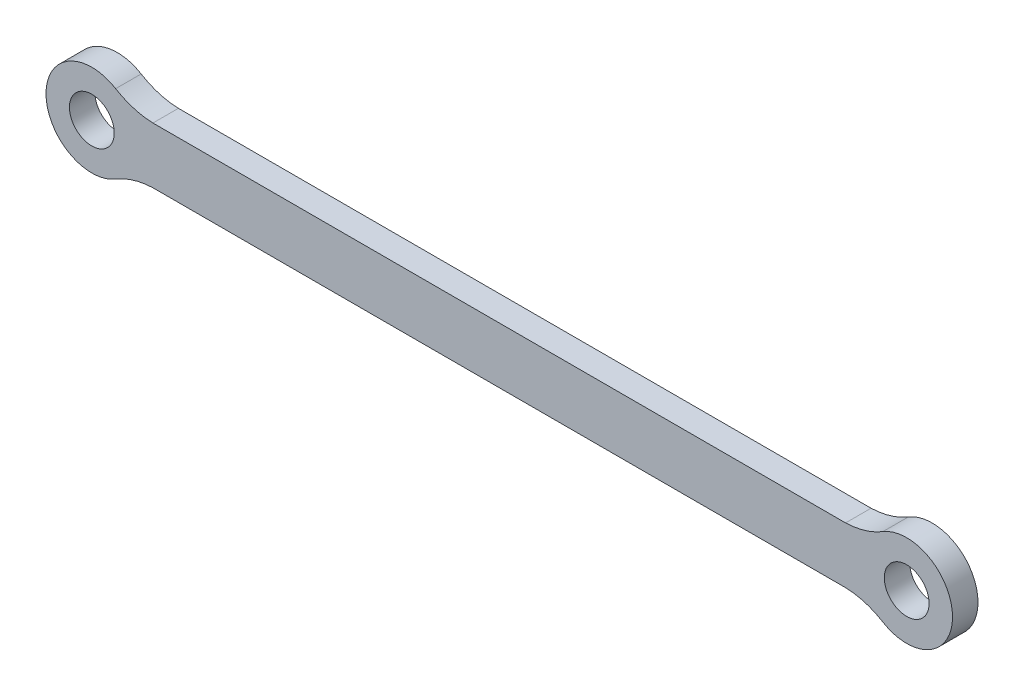
ISO-10303-21;
HEADER;
FILE_DESCRIPTION(('STEP AP214'),'2;1');
FILE_NAME('part.step','',(''),(''),'','','');
FILE_SCHEMA(('AUTOMOTIVE_DESIGN { 1 0 10303 214 1 1 1 1 }'));
ENDSEC;
DATA;
#1=APPLICATION_CONTEXT('core data for automotive mechanical design processes');
#2=APPLICATION_PROTOCOL_DEFINITION('international standard','automotive_design',2000,#1);
#3=PRODUCT_CONTEXT('',#1,'mechanical');
#4=PRODUCT('Part','Part','',(#3));
#5=PRODUCT_RELATED_PRODUCT_CATEGORY('part','',(#4));
#6=PRODUCT_DEFINITION_FORMATION('','',#4);
#7=PRODUCT_DEFINITION_CONTEXT('part definition',#1,'design');
#8=PRODUCT_DEFINITION('design','',#6,#7);
#9=PRODUCT_DEFINITION_SHAPE('','',#8);
#10=(LENGTH_UNIT() NAMED_UNIT(*) SI_UNIT(.MILLI.,.METRE.));
#11=(NAMED_UNIT(*) PLANE_ANGLE_UNIT() SI_UNIT($,.RADIAN.));
#12=(NAMED_UNIT(*) SI_UNIT($,.STERADIAN.) SOLID_ANGLE_UNIT());
#13=UNCERTAINTY_MEASURE_WITH_UNIT(LENGTH_MEASURE(1.E-05),#10,'distance_accuracy_value','');
#14=(GEOMETRIC_REPRESENTATION_CONTEXT(3) GLOBAL_UNCERTAINTY_ASSIGNED_CONTEXT((#13)) GLOBAL_UNIT_ASSIGNED_CONTEXT((#10,
#11,#12)) REPRESENTATION_CONTEXT('',''));
#15=CARTESIAN_POINT('',(0.,0.,0.));
#16=DIRECTION('',(0.,0.,1.));
#17=DIRECTION('',(1.,0.,0.));
#18=AXIS2_PLACEMENT_3D('',#15,#16,#17);
#19=CARTESIAN_POINT('',(-67.5199342692378,-20.499950228253,5.));
#20=DIRECTION('',(0.,0.,1.));
#21=DIRECTION('',(1.,0.,0.));
#22=AXIS2_PLACEMENT_3D('',#19,#20,#21);
#23=PLANE('',#22);
#24=CARTESIAN_POINT('',(-80.,0.,5.));
#25=DIRECTION('',(0.,0.,1.));
#26=DIRECTION('',(1.,0.,0.));
#27=AXIS2_PLACEMENT_3D('',#24,#25,#26);
#28=CIRCLE('',#27,4.40000000000001);
#29=CARTESIAN_POINT('',(-75.6,0.,5.));
#30=VERTEX_POINT('',#29);
#31=EDGE_CURVE('E133',#30,#30,#28,.T.);
#32=ORIENTED_EDGE('',*,*,#31,.F.);
#33=EDGE_LOOP('',(#32));
#34=FACE_BOUND('',#33,.T.);
#35=CARTESIAN_POINT('',(-67.5199342692378,-20.499950228253,5.));
#36=DIRECTION('',(0.,0.,-1.));
#37=DIRECTION('',(1.,0.,0.));
#38=AXIS2_PLACEMENT_3D('',#35,#36,#37);
#39=CIRCLE('',#38,14.9999999999772);
#40=CARTESIAN_POINT('',(-75.320005990589,-7.68749998869718,5.));
#41=VERTEX_POINT('',#40);
#42=CARTESIAN_POINT('',(-68.,-5.50763429996943,5.));
#43=VERTEX_POINT('',#42);
#44=EDGE_CURVE('E144',#41,#43,#39,.T.);
#45=ORIENTED_EDGE('',*,*,#44,.T.);
#46=DIRECTION('',(1.,0.,0.));
#47=VECTOR('',#46,1.);
#48=CARTESIAN_POINT('',(-68.,-5.50763429996943,5.));
#49=LINE('',#48,#47);
#50=CARTESIAN_POINT('',(68.,-5.50763429996943,5.));
#51=VERTEX_POINT('',#50);
#52=EDGE_CURVE('E92',#43,#51,#49,.T.);
#53=ORIENTED_EDGE('',*,*,#52,.T.);
#54=CARTESIAN_POINT('',(67.519934269238,-20.499950228253,5.));
#55=DIRECTION('',(0.,0.,-1.));
#56=DIRECTION('',(1.,0.,0.));
#57=AXIS2_PLACEMENT_3D('',#54,#55,#56);
#58=CIRCLE('',#57,14.9999999999772);
#59=CARTESIAN_POINT('',(75.3200060094935,-7.68750000020588,5.));
#60=VERTEX_POINT('',#59);
#61=EDGE_CURVE('E159',#51,#60,#58,.T.);
#62=ORIENTED_EDGE('',*,*,#61,.T.);
#63=CARTESIAN_POINT('',(80.,0.,5.));
#64=DIRECTION('',(0.,0.,1.));
#65=DIRECTION('',(1.,0.,0.));
#66=AXIS2_PLACEMENT_3D('',#63,#64,#65);
#67=CIRCLE('',#66,9.00000000024122);
#68=CARTESIAN_POINT('',(75.3200060094935,7.68750000020587,5.));
#69=VERTEX_POINT('',#68);
#70=EDGE_CURVE('E172',#60,#69,#67,.T.);
#71=ORIENTED_EDGE('',*,*,#70,.T.);
#72=CARTESIAN_POINT('',(67.5199342999245,20.4999502469346,5.));
#73=DIRECTION('',(0.,0.,-1.));
#74=DIRECTION('',(1.,0.,0.));
#75=AXIS2_PLACEMENT_3D('',#72,#73,#74);
#76=CIRCLE('',#75,14.9999999999772);
#77=CARTESIAN_POINT('',(68.,5.50763431766841,5.));
#78=VERTEX_POINT('',#77);
#79=EDGE_CURVE('E111',#69,#78,#76,.T.);
#80=ORIENTED_EDGE('',*,*,#79,.T.);
#81=DIRECTION('',(-1.,0.,0.));
#82=VECTOR('',#81,1.);
#83=CARTESIAN_POINT('',(68.,5.50763431766841,5.));
#84=LINE('',#83,#82);
#85=CARTESIAN_POINT('',(-68.,5.5076343176684,5.));
#86=VERTEX_POINT('',#85);
#87=EDGE_CURVE('E105',#78,#86,#84,.T.);
#88=ORIENTED_EDGE('',*,*,#87,.T.);
#89=CARTESIAN_POINT('',(-67.5199342999242,20.4999502469346,5.));
#90=DIRECTION('',(0.,0.,-1.));
#91=DIRECTION('',(1.,0.,0.));
#92=AXIS2_PLACEMENT_3D('',#89,#90,#91);
#93=CIRCLE('',#92,14.9999999999772);
#94=CARTESIAN_POINT('',(-75.320005990589,7.68749998869718,5.));
#95=VERTEX_POINT('',#94);
#96=EDGE_CURVE('E109',#86,#95,#93,.T.);
#97=ORIENTED_EDGE('',*,*,#96,.T.);
#98=CARTESIAN_POINT('',(-80.,0.,5.));
#99=DIRECTION('',(0.,0.,1.));
#100=DIRECTION('',(1.,0.,0.));
#101=AXIS2_PLACEMENT_3D('',#98,#99,#100);
#102=CIRCLE('',#101,9.00000000024122);
#103=EDGE_CURVE('E49',#95,#41,#102,.T.);
#104=ORIENTED_EDGE('',*,*,#103,.T.);
#105=EDGE_LOOP('',(#45,#53,#62,#71,#80,#88,#97,#104));
#106=FACE_BOUND('',#105,.T.);
#107=CARTESIAN_POINT('',(80.,0.,5.));
#108=DIRECTION('',(0.,0.,1.));
#109=DIRECTION('',(1.,0.,0.));
#110=AXIS2_PLACEMENT_3D('',#107,#108,#109);
#111=CIRCLE('',#110,4.39999999999995);
#112=CARTESIAN_POINT('',(84.4,0.,5.));
#113=VERTEX_POINT('',#112);
#114=EDGE_CURVE('E181',#113,#113,#111,.T.);
#115=ORIENTED_EDGE('',*,*,#114,.F.);
#116=EDGE_LOOP('',(#115));
#117=FACE_BOUND('',#116,.T.);
#118=ADVANCED_FACE('F32',(#34,#106,#117),#23,.T.);
#119=CARTESIAN_POINT('',(-67.5199342692378,-20.499950228253,0.));
#120=DIRECTION('',(0.,0.,1.));
#121=DIRECTION('',(1.,0.,0.));
#122=AXIS2_PLACEMENT_3D('',#119,#120,#121);
#123=PLANE('',#122);
#124=CARTESIAN_POINT('',(-67.5199342692378,-20.499950228253,0.));
#125=DIRECTION('',(0.,0.,-1.));
#126=DIRECTION('',(1.,0.,0.));
#127=AXIS2_PLACEMENT_3D('',#124,#125,#126);
#128=CIRCLE('',#127,14.9999999999772);
#129=CARTESIAN_POINT('',(-75.320005990589,-7.68749998869718,0.));
#130=VERTEX_POINT('',#129);
#131=CARTESIAN_POINT('',(-68.,-5.50763429996943,0.));
#132=VERTEX_POINT('',#131);
#133=EDGE_CURVE('E129',#130,#132,#128,.T.);
#134=ORIENTED_EDGE('',*,*,#133,.F.);
#135=CARTESIAN_POINT('',(-80.,0.,0.));
#136=DIRECTION('',(0.,0.,1.));
#137=DIRECTION('',(1.,0.,0.));
#138=AXIS2_PLACEMENT_3D('',#135,#136,#137);
#139=CIRCLE('',#138,9.00000000024122);
#140=CARTESIAN_POINT('',(-75.320005990589,7.68749998869718,0.));
#141=VERTEX_POINT('',#140);
#142=EDGE_CURVE('E84',#141,#130,#139,.T.);
#143=ORIENTED_EDGE('',*,*,#142,.F.);
#144=CARTESIAN_POINT('',(-67.5199342999242,20.4999502469346,0.));
#145=DIRECTION('',(0.,0.,-1.));
#146=DIRECTION('',(1.,0.,0.));
#147=AXIS2_PLACEMENT_3D('',#144,#145,#146);
#148=CIRCLE('',#147,14.9999999999772);
#149=CARTESIAN_POINT('',(-68.,5.5076343176684,0.));
#150=VERTEX_POINT('',#149);
#151=EDGE_CURVE('E78',#150,#141,#148,.T.);
#152=ORIENTED_EDGE('',*,*,#151,.F.);
#153=DIRECTION('',(-1.,0.,0.));
#154=VECTOR('',#153,1.);
#155=CARTESIAN_POINT('',(68.,5.50763431766841,0.));
#156=LINE('',#155,#154);
#157=CARTESIAN_POINT('',(68.,5.50763431766841,0.));
#158=VERTEX_POINT('',#157);
#159=EDGE_CURVE('E119',#158,#150,#156,.T.);
#160=ORIENTED_EDGE('',*,*,#159,.F.);
#161=CARTESIAN_POINT('',(67.5199342999245,20.4999502469346,0.));
#162=DIRECTION('',(0.,0.,-1.));
#163=DIRECTION('',(1.,0.,0.));
#164=AXIS2_PLACEMENT_3D('',#161,#162,#163);
#165=CIRCLE('',#164,14.9999999999772);
#166=CARTESIAN_POINT('',(75.3200060094935,7.68750000020587,0.));
#167=VERTEX_POINT('',#166);
#168=EDGE_CURVE('E139',#167,#158,#165,.T.);
#169=ORIENTED_EDGE('',*,*,#168,.F.);
#170=CARTESIAN_POINT('',(80.,0.,0.));
#171=DIRECTION('',(0.,0.,1.));
#172=DIRECTION('',(1.,0.,0.));
#173=AXIS2_PLACEMENT_3D('',#170,#171,#172);
#174=CIRCLE('',#173,9.00000000024122);
#175=CARTESIAN_POINT('',(75.3200060094935,-7.68750000020588,0.));
#176=VERTEX_POINT('',#175);
#177=EDGE_CURVE('E137',#176,#167,#174,.T.);
#178=ORIENTED_EDGE('',*,*,#177,.F.);
#179=CARTESIAN_POINT('',(67.519934269238,-20.499950228253,0.));
#180=DIRECTION('',(0.,0.,-1.));
#181=DIRECTION('',(1.,0.,0.));
#182=AXIS2_PLACEMENT_3D('',#179,#180,#181);
#183=CIRCLE('',#182,14.9999999999772);
#184=CARTESIAN_POINT('',(68.,-5.50763429996943,0.));
#185=VERTEX_POINT('',#184);
#186=EDGE_CURVE('E135',#185,#176,#183,.T.);
#187=ORIENTED_EDGE('',*,*,#186,.F.);
#188=DIRECTION('',(1.,0.,0.));
#189=VECTOR('',#188,1.);
#190=CARTESIAN_POINT('',(-68.,-5.50763429996943,0.));
#191=LINE('',#190,#189);
#192=EDGE_CURVE('E132',#132,#185,#191,.T.);
#193=ORIENTED_EDGE('',*,*,#192,.F.);
#194=EDGE_LOOP('',(#134,#143,#152,#160,#169,#178,#187,#193));
#195=FACE_BOUND('',#194,.T.);
#196=CARTESIAN_POINT('',(-80.,0.,0.));
#197=DIRECTION('',(0.,0.,1.));
#198=DIRECTION('',(1.,0.,0.));
#199=AXIS2_PLACEMENT_3D('',#196,#197,#198);
#200=CIRCLE('',#199,4.40000000000001);
#201=CARTESIAN_POINT('',(-75.6,0.,0.));
#202=VERTEX_POINT('',#201);
#203=EDGE_CURVE('E178',#202,#202,#200,.T.);
#204=ORIENTED_EDGE('',*,*,#203,.T.);
#205=EDGE_LOOP('',(#204));
#206=FACE_BOUND('',#205,.T.);
#207=CARTESIAN_POINT('',(80.,0.,0.));
#208=DIRECTION('',(0.,0.,1.));
#209=DIRECTION('',(1.,0.,0.));
#210=AXIS2_PLACEMENT_3D('',#207,#208,#209);
#211=CIRCLE('',#210,4.39999999999995);
#212=CARTESIAN_POINT('',(84.4,0.,0.));
#213=VERTEX_POINT('',#212);
#214=EDGE_CURVE('E184',#213,#213,#211,.T.);
#215=ORIENTED_EDGE('',*,*,#214,.T.);
#216=EDGE_LOOP('',(#215));
#217=FACE_BOUND('',#216,.T.);
#218=ADVANCED_FACE('F163',(#195,#206,#217),#123,.F.);
#219=CARTESIAN_POINT('',(-67.5199342692378,-20.499950228253,5.));
#220=DIRECTION('',(0.,0.,-1.));
#221=DIRECTION('',(-1.,0.,0.));
#222=AXIS2_PLACEMENT_3D('',#219,#220,#221);
#223=CYLINDRICAL_SURFACE('',#222,14.9999999999772);
#224=ORIENTED_EDGE('',*,*,#133,.T.);
#225=DIRECTION('',(0.,0.,-1.));
#226=VECTOR('',#225,1.);
#227=CARTESIAN_POINT('',(-68.,-5.50763429996943,5.));
#228=LINE('',#227,#226);
#229=EDGE_CURVE('E11',#43,#132,#228,.T.);
#230=ORIENTED_EDGE('',*,*,#229,.F.);
#231=ORIENTED_EDGE('',*,*,#44,.F.);
#232=DIRECTION('',(0.,0.,-1.));
#233=VECTOR('',#232,1.);
#234=CARTESIAN_POINT('',(-75.320005990589,-7.68749998869718,5.));
#235=LINE('',#234,#233);
#236=EDGE_CURVE('E125',#41,#130,#235,.T.);
#237=ORIENTED_EDGE('',*,*,#236,.T.);
#238=EDGE_LOOP('',(#224,#230,#231,#237));
#239=FACE_BOUND('',#238,.T.);
#240=ADVANCED_FACE('F34',(#239),#223,.F.);
#241=CARTESIAN_POINT('',(-68.,-5.50763429996943,5.));
#242=DIRECTION('',(0.,1.,0.));
#243=DIRECTION('',(0.,0.,1.));
#244=AXIS2_PLACEMENT_3D('',#241,#242,#243);
#245=PLANE('',#244);
#246=ORIENTED_EDGE('',*,*,#192,.T.);
#247=DIRECTION('',(0.,0.,-1.));
#248=VECTOR('',#247,1.);
#249=CARTESIAN_POINT('',(68.,-5.50763429996943,5.));
#250=LINE('',#249,#248);
#251=EDGE_CURVE('E41',#51,#185,#250,.T.);
#252=ORIENTED_EDGE('',*,*,#251,.F.);
#253=ORIENTED_EDGE('',*,*,#52,.F.);
#254=ORIENTED_EDGE('',*,*,#229,.T.);
#255=EDGE_LOOP('',(#246,#252,#253,#254));
#256=FACE_BOUND('',#255,.T.);
#257=ADVANCED_FACE('F216',(#256),#245,.F.);
#258=CARTESIAN_POINT('',(67.519934269238,-20.499950228253,5.));
#259=DIRECTION('',(0.,0.,-1.));
#260=DIRECTION('',(-1.,0.,0.));
#261=AXIS2_PLACEMENT_3D('',#258,#259,#260);
#262=CYLINDRICAL_SURFACE('',#261,14.9999999999772);
#263=ORIENTED_EDGE('',*,*,#186,.T.);
#264=DIRECTION('',(0.,0.,-1.));
#265=VECTOR('',#264,1.);
#266=CARTESIAN_POINT('',(75.3200060094935,-7.68750000020588,5.));
#267=LINE('',#266,#265);
#268=EDGE_CURVE('E151',#60,#176,#267,.T.);
#269=ORIENTED_EDGE('',*,*,#268,.F.);
#270=ORIENTED_EDGE('',*,*,#61,.F.);
#271=ORIENTED_EDGE('',*,*,#251,.T.);
#272=EDGE_LOOP('',(#263,#269,#270,#271));
#273=FACE_BOUND('',#272,.T.);
#274=ADVANCED_FACE('F157',(#273),#262,.F.);
#275=CARTESIAN_POINT('',(80.,0.,5.));
#276=DIRECTION('',(0.,0.,-1.));
#277=DIRECTION('',(-1.,0.,0.));
#278=AXIS2_PLACEMENT_3D('',#275,#276,#277);
#279=CYLINDRICAL_SURFACE('',#278,9.00000000024122);
#280=ORIENTED_EDGE('',*,*,#177,.T.);
#281=DIRECTION('',(0.,0.,-1.));
#282=VECTOR('',#281,1.);
#283=CARTESIAN_POINT('',(75.3200060094935,7.68750000020587,5.));
#284=LINE('',#283,#282);
#285=EDGE_CURVE('E148',#69,#167,#284,.T.);
#286=ORIENTED_EDGE('',*,*,#285,.F.);
#287=ORIENTED_EDGE('',*,*,#70,.F.);
#288=ORIENTED_EDGE('',*,*,#268,.T.);
#289=EDGE_LOOP('',(#280,#286,#287,#288));
#290=FACE_BOUND('',#289,.T.);
#291=ADVANCED_FACE('F168',(#290),#279,.T.);
#292=CARTESIAN_POINT('',(67.5199342999245,20.4999502469346,5.));
#293=DIRECTION('',(0.,0.,-1.));
#294=DIRECTION('',(-1.,0.,0.));
#295=AXIS2_PLACEMENT_3D('',#292,#293,#294);
#296=CYLINDRICAL_SURFACE('',#295,14.9999999999772);
#297=ORIENTED_EDGE('',*,*,#168,.T.);
#298=DIRECTION('',(0.,0.,-1.));
#299=VECTOR('',#298,1.);
#300=CARTESIAN_POINT('',(68.,5.50763431766841,5.));
#301=LINE('',#300,#299);
#302=EDGE_CURVE('E120',#78,#158,#301,.T.);
#303=ORIENTED_EDGE('',*,*,#302,.F.);
#304=ORIENTED_EDGE('',*,*,#79,.F.);
#305=ORIENTED_EDGE('',*,*,#285,.T.);
#306=EDGE_LOOP('',(#297,#303,#304,#305));
#307=FACE_BOUND('',#306,.T.);
#308=ADVANCED_FACE('F171',(#307),#296,.F.);
#309=CARTESIAN_POINT('',(68.,5.50763431766841,5.));
#310=DIRECTION('',(0.,-1.,0.));
#311=DIRECTION('',(1.,0.,0.));
#312=AXIS2_PLACEMENT_3D('',#309,#310,#311);
#313=PLANE('',#312);
#314=ORIENTED_EDGE('',*,*,#159,.T.);
#315=DIRECTION('',(0.,0.,-1.));
#316=VECTOR('',#315,1.);
#317=CARTESIAN_POINT('',(-68.,5.5076343176684,5.));
#318=LINE('',#317,#316);
#319=EDGE_CURVE('E116',#86,#150,#318,.T.);
#320=ORIENTED_EDGE('',*,*,#319,.F.);
#321=ORIENTED_EDGE('',*,*,#87,.F.);
#322=ORIENTED_EDGE('',*,*,#302,.T.);
#323=EDGE_LOOP('',(#314,#320,#321,#322));
#324=FACE_BOUND('',#323,.T.);
#325=ADVANCED_FACE('F117',(#324),#313,.F.);
#326=CARTESIAN_POINT('',(-67.5199342999242,20.4999502469346,5.));
#327=DIRECTION('',(0.,0.,-1.));
#328=DIRECTION('',(-1.,0.,0.));
#329=AXIS2_PLACEMENT_3D('',#326,#327,#328);
#330=CYLINDRICAL_SURFACE('',#329,14.9999999999772);
#331=ORIENTED_EDGE('',*,*,#151,.T.);
#332=DIRECTION('',(0.,0.,-1.));
#333=VECTOR('',#332,1.);
#334=CARTESIAN_POINT('',(-75.320005990589,7.68749998869718,5.));
#335=LINE('',#334,#333);
#336=EDGE_CURVE('E121',#95,#141,#335,.T.);
#337=ORIENTED_EDGE('',*,*,#336,.F.);
#338=ORIENTED_EDGE('',*,*,#96,.F.);
#339=ORIENTED_EDGE('',*,*,#319,.T.);
#340=EDGE_LOOP('',(#331,#337,#338,#339));
#341=FACE_BOUND('',#340,.T.);
#342=ADVANCED_FACE('F123',(#341),#330,.F.);
#343=CARTESIAN_POINT('',(-80.,0.,5.));
#344=DIRECTION('',(0.,0.,-1.));
#345=DIRECTION('',(-1.,0.,0.));
#346=AXIS2_PLACEMENT_3D('',#343,#344,#345);
#347=CYLINDRICAL_SURFACE('',#346,9.00000000024122);
#348=ORIENTED_EDGE('',*,*,#142,.T.);
#349=ORIENTED_EDGE('',*,*,#236,.F.);
#350=ORIENTED_EDGE('',*,*,#103,.F.);
#351=ORIENTED_EDGE('',*,*,#336,.T.);
#352=EDGE_LOOP('',(#348,#349,#350,#351));
#353=FACE_BOUND('',#352,.T.);
#354=ADVANCED_FACE('F204',(#353),#347,.T.);
#355=CARTESIAN_POINT('',(-80.,0.,5.));
#356=DIRECTION('',(0.,0.,-1.));
#357=DIRECTION('',(-1.,0.,0.));
#358=AXIS2_PLACEMENT_3D('',#355,#356,#357);
#359=CYLINDRICAL_SURFACE('',#358,4.40000000000001);
#360=ORIENTED_EDGE('',*,*,#31,.T.);
#361=EDGE_LOOP('',(#360));
#362=FACE_BOUND('',#361,.T.);
#363=ORIENTED_EDGE('',*,*,#203,.F.);
#364=EDGE_LOOP('',(#363));
#365=FACE_BOUND('',#364,.T.);
#366=ADVANCED_FACE('F201',(#362,#365),#359,.F.);
#367=CARTESIAN_POINT('',(80.,0.,5.));
#368=DIRECTION('',(0.,0.,-1.));
#369=DIRECTION('',(-1.,0.,0.));
#370=AXIS2_PLACEMENT_3D('',#367,#368,#369);
#371=CYLINDRICAL_SURFACE('',#370,4.39999999999995);
#372=ORIENTED_EDGE('',*,*,#114,.T.);
#373=EDGE_LOOP('',(#372));
#374=FACE_BOUND('',#373,.T.);
#375=ORIENTED_EDGE('',*,*,#214,.F.);
#376=EDGE_LOOP('',(#375));
#377=FACE_BOUND('',#376,.T.);
#378=ADVANCED_FACE('F190',(#374,#377),#371,.F.);
#379=CLOSED_SHELL('',(#118,#218,#240,#257,#274,#291,#308,#325,#342,#354,#366,#378));
#380=MANIFOLD_SOLID_BREP('B2',#379);
#381=ADVANCED_BREP_SHAPE_REPRESENTATION('',(#18,#380),#14);
#382=SHAPE_DEFINITION_REPRESENTATION(#9,#381);
ENDSEC;
END-ISO-10303-21;
